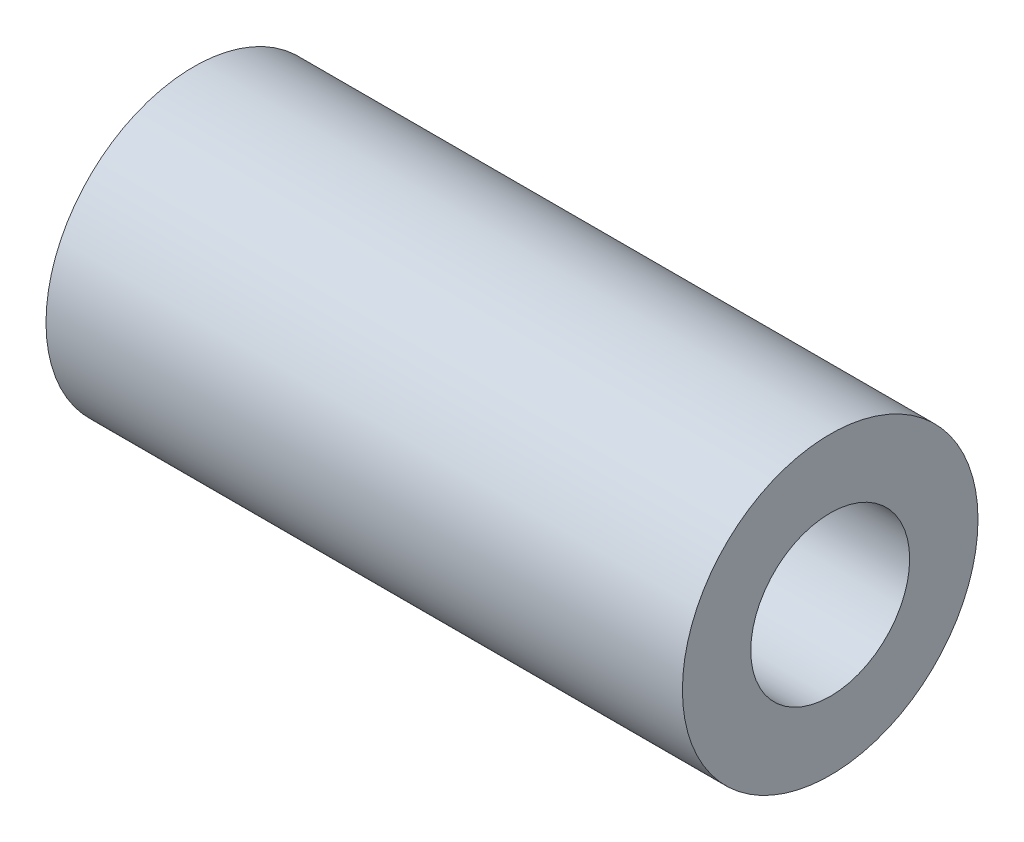
ISO-10303-21;
HEADER;
FILE_DESCRIPTION(('STEP AP214'),'2;1');
FILE_NAME('part.step','',(''),(''),'','','');
FILE_SCHEMA(('AUTOMOTIVE_DESIGN { 1 0 10303 214 1 1 1 1 }'));
ENDSEC;
DATA;
#1=APPLICATION_CONTEXT('core data for automotive mechanical design processes');
#2=APPLICATION_PROTOCOL_DEFINITION('international standard','automotive_design',2000,#1);
#3=PRODUCT_CONTEXT('',#1,'mechanical');
#4=PRODUCT('Part','Part','',(#3));
#5=PRODUCT_RELATED_PRODUCT_CATEGORY('part','',(#4));
#6=PRODUCT_DEFINITION_FORMATION('','',#4);
#7=PRODUCT_DEFINITION_CONTEXT('part definition',#1,'design');
#8=PRODUCT_DEFINITION('design','',#6,#7);
#9=PRODUCT_DEFINITION_SHAPE('','',#8);
#10=(LENGTH_UNIT() NAMED_UNIT(*) SI_UNIT(.MILLI.,.METRE.));
#11=(NAMED_UNIT(*) PLANE_ANGLE_UNIT() SI_UNIT($,.RADIAN.));
#12=(NAMED_UNIT(*) SI_UNIT($,.STERADIAN.) SOLID_ANGLE_UNIT());
#13=UNCERTAINTY_MEASURE_WITH_UNIT(LENGTH_MEASURE(1.E-05),#10,'distance_accuracy_value','');
#14=(GEOMETRIC_REPRESENTATION_CONTEXT(3) GLOBAL_UNCERTAINTY_ASSIGNED_CONTEXT((#13)) GLOBAL_UNIT_ASSIGNED_CONTEXT((#10,
#11,#12)) REPRESENTATION_CONTEXT('',''));
#15=CARTESIAN_POINT('',(0.,0.,0.));
#16=DIRECTION('',(0.,0.,1.));
#17=DIRECTION('',(1.,0.,0.));
#18=AXIS2_PLACEMENT_3D('',#15,#16,#17);
#19=CARTESIAN_POINT('',(-40.75,11.694326346384,29.6496576878358));
#20=DIRECTION('',(1.,0.,0.));
#21=DIRECTION('',(0.,0.,-1.));
#22=AXIS2_PLACEMENT_3D('',#19,#20,#21);
#23=PLANE('',#22);
#24=CARTESIAN_POINT('',(-40.75,31.,45.5936491931449));
#25=DIRECTION('',(1.,0.,0.));
#26=DIRECTION('',(0.,0.,-1.));
#27=AXIS2_PLACEMENT_3D('',#24,#25,#26);
#28=CIRCLE('',#27,2.15);
#29=CARTESIAN_POINT('',(-40.75,31.,43.4436491931449));
#30=VERTEX_POINT('',#29);
#31=EDGE_CURVE('E50',#30,#30,#28,.T.);
#32=ORIENTED_EDGE('',*,*,#31,.T.);
#33=EDGE_LOOP('',(#32));
#34=FACE_BOUND('',#33,.T.);
#35=CARTESIAN_POINT('',(-40.75,31.,45.5936491931449));
#36=DIRECTION('',(-1.,0.,0.));
#37=DIRECTION('',(0.,0.,-1.));
#38=AXIS2_PLACEMENT_3D('',#35,#36,#37);
#39=CIRCLE('',#38,3.99999999999999);
#40=CARTESIAN_POINT('',(-40.75,31.,41.5936491931449));
#41=VERTEX_POINT('',#40);
#42=EDGE_CURVE('E41',#41,#41,#39,.T.);
#43=ORIENTED_EDGE('',*,*,#42,.T.);
#44=EDGE_LOOP('',(#43));
#45=FACE_BOUND('',#44,.T.);
#46=ADVANCED_FACE('F37',(#34,#45),#23,.F.);
#47=CARTESIAN_POINT('',(-23.525,31.,45.5936491931449));
#48=DIRECTION('',(-1.,0.,0.));
#49=DIRECTION('',(0.,0.,1.));
#50=AXIS2_PLACEMENT_3D('',#47,#48,#49);
#51=PLANE('',#50);
#52=CARTESIAN_POINT('',(-23.525,31.,45.5936491931449));
#53=DIRECTION('',(-1.,0.,0.));
#54=DIRECTION('',(0.,0.,1.));
#55=AXIS2_PLACEMENT_3D('',#52,#53,#54);
#56=CIRCLE('',#55,2.15);
#57=CARTESIAN_POINT('',(-23.525,31.,47.7436491931449));
#58=VERTEX_POINT('',#57);
#59=EDGE_CURVE('E45',#58,#58,#56,.T.);
#60=ORIENTED_EDGE('',*,*,#59,.T.);
#61=EDGE_LOOP('',(#60));
#62=FACE_BOUND('',#61,.T.);
#63=CARTESIAN_POINT('',(-23.525,31.,45.5936491931449));
#64=DIRECTION('',(-1.,0.,0.));
#65=DIRECTION('',(0.,0.,1.));
#66=AXIS2_PLACEMENT_3D('',#63,#64,#65);
#67=CIRCLE('',#66,4.00000000000001);
#68=CARTESIAN_POINT('',(-23.525,31.,49.5936491931449));
#69=VERTEX_POINT('',#68);
#70=EDGE_CURVE('E10',#69,#69,#67,.T.);
#71=ORIENTED_EDGE('',*,*,#70,.F.);
#72=EDGE_LOOP('',(#71));
#73=FACE_BOUND('',#72,.T.);
#74=ADVANCED_FACE('F61',(#62,#73),#51,.F.);
#75=CARTESIAN_POINT('',(-45.952,31.,45.5936491931449));
#76=DIRECTION('',(1.,0.,0.));
#77=DIRECTION('',(0.,0.,-1.));
#78=AXIS2_PLACEMENT_3D('',#75,#76,#77);
#79=CYLINDRICAL_SURFACE('',#78,4.00000000000001);
#80=ORIENTED_EDGE('',*,*,#70,.T.);
#81=EDGE_LOOP('',(#80));
#82=FACE_BOUND('',#81,.T.);
#83=ORIENTED_EDGE('',*,*,#42,.F.);
#84=EDGE_LOOP('',(#83));
#85=FACE_BOUND('',#84,.T.);
#86=ADVANCED_FACE('F39',(#82,#85),#79,.T.);
#87=CARTESIAN_POINT('',(-45.952,31.,45.5936491931449));
#88=DIRECTION('',(1.,0.,0.));
#89=DIRECTION('',(0.,0.,-1.));
#90=AXIS2_PLACEMENT_3D('',#87,#88,#89);
#91=CYLINDRICAL_SURFACE('',#90,2.15);
#92=ORIENTED_EDGE('',*,*,#31,.F.);
#93=EDGE_LOOP('',(#92));
#94=FACE_BOUND('',#93,.T.);
#95=ORIENTED_EDGE('',*,*,#59,.F.);
#96=EDGE_LOOP('',(#95));
#97=FACE_BOUND('',#96,.T.);
#98=ADVANCED_FACE('F60',(#94,#97),#91,.F.);
#99=CLOSED_SHELL('',(#46,#74,#86,#98));
#100=MANIFOLD_SOLID_BREP('B2',#99);
#101=ADVANCED_BREP_SHAPE_REPRESENTATION('',(#18,#100),#14);
#102=SHAPE_DEFINITION_REPRESENTATION(#9,#101);
ENDSEC;
END-ISO-10303-21;
